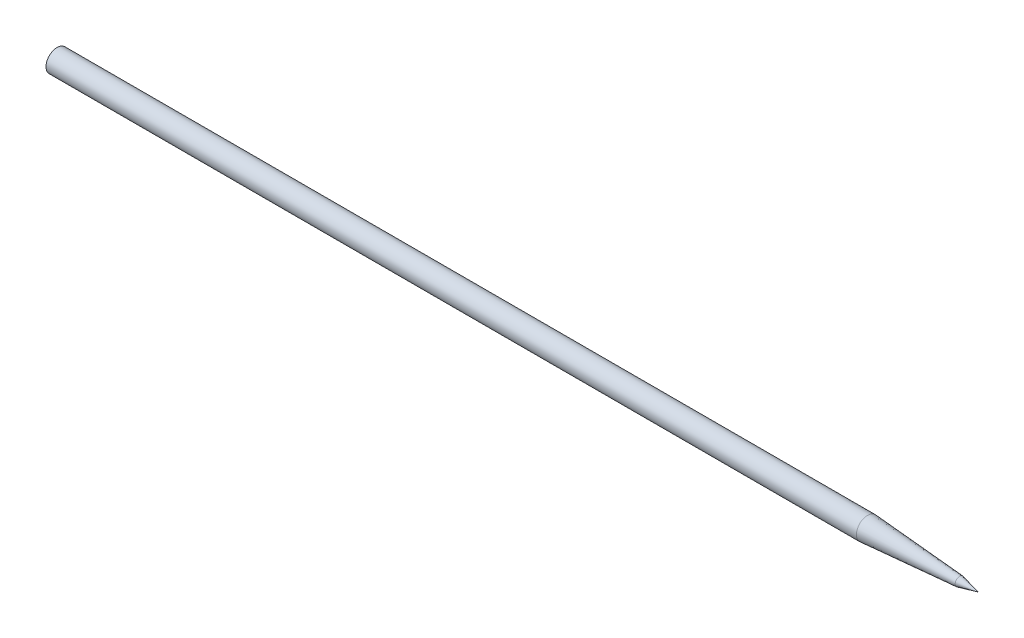
ISO-10303-21;
HEADER;
FILE_DESCRIPTION(('STEP AP214'),'2;1');
FILE_NAME('part.step','',(''),(''),'','','');
FILE_SCHEMA(('AUTOMOTIVE_DESIGN { 1 0 10303 214 1 1 1 1 }'));
ENDSEC;
DATA;
#1=APPLICATION_CONTEXT('core data for automotive mechanical design processes');
#2=APPLICATION_PROTOCOL_DEFINITION('international standard','automotive_design',2000,#1);
#3=PRODUCT_CONTEXT('',#1,'mechanical');
#4=PRODUCT('Part','Part','',(#3));
#5=PRODUCT_RELATED_PRODUCT_CATEGORY('part','',(#4));
#6=PRODUCT_DEFINITION_FORMATION('','',#4);
#7=PRODUCT_DEFINITION_CONTEXT('part definition',#1,'design');
#8=PRODUCT_DEFINITION('design','',#6,#7);
#9=PRODUCT_DEFINITION_SHAPE('','',#8);
#10=(LENGTH_UNIT() NAMED_UNIT(*) SI_UNIT(.MILLI.,.METRE.));
#11=(NAMED_UNIT(*) PLANE_ANGLE_UNIT() SI_UNIT($,.RADIAN.));
#12=(NAMED_UNIT(*) SI_UNIT($,.STERADIAN.) SOLID_ANGLE_UNIT());
#13=UNCERTAINTY_MEASURE_WITH_UNIT(LENGTH_MEASURE(1.E-05),#10,'distance_accuracy_value','');
#14=(GEOMETRIC_REPRESENTATION_CONTEXT(3) GLOBAL_UNCERTAINTY_ASSIGNED_CONTEXT((#13)) GLOBAL_UNIT_ASSIGNED_CONTEXT((#10,
#11,#12)) REPRESENTATION_CONTEXT('',''));
#15=CARTESIAN_POINT('',(0.,0.,0.));
#16=DIRECTION('',(0.,0.,1.));
#17=DIRECTION('',(1.,0.,0.));
#18=AXIS2_PLACEMENT_3D('',#15,#16,#17);
#19=CARTESIAN_POINT('',(0.,0.,0.));
#20=DIRECTION('',(1.,0.,0.));
#21=DIRECTION('',(0.,0.,-1.));
#22=AXIS2_PLACEMENT_3D('',#19,#20,#21);
#23=PLANE('',#22);
#24=CARTESIAN_POINT('',(0.,0.,0.));
#25=DIRECTION('',(-1.,0.,0.));
#26=DIRECTION('',(0.,0.,1.));
#27=AXIS2_PLACEMENT_3D('',#24,#25,#26);
#28=CIRCLE('',#27,3.);
#29=CARTESIAN_POINT('',(0.,0.,3.));
#30=VERTEX_POINT('',#29);
#31=EDGE_CURVE('E11',#30,#30,#28,.T.);
#32=ORIENTED_EDGE('',*,*,#31,.T.);
#33=EDGE_LOOP('',(#32));
#34=FACE_BOUND('',#33,.T.);
#35=ADVANCED_FACE('F39',(#34),#23,.F.);
#36=CARTESIAN_POINT('',(-10.,0.,0.));
#37=DIRECTION('',(-1.,0.,0.));
#38=DIRECTION('',(0.,0.,1.));
#39=AXIS2_PLACEMENT_3D('',#36,#37,#38);
#40=CYLINDRICAL_SURFACE('',#39,3.);
#41=ORIENTED_EDGE('',*,*,#31,.F.);
#42=EDGE_LOOP('',(#41));
#43=FACE_BOUND('',#42,.T.);
#44=CARTESIAN_POINT('',(220.,0.,0.));
#45=DIRECTION('',(-1.,0.,0.));
#46=DIRECTION('',(0.,0.,1.));
#47=AXIS2_PLACEMENT_3D('',#44,#45,#46);
#48=CIRCLE('',#47,3.);
#49=CARTESIAN_POINT('',(220.,0.,3.));
#50=VERTEX_POINT('',#49);
#51=EDGE_CURVE('E45',#50,#50,#48,.T.);
#52=ORIENTED_EDGE('',*,*,#51,.T.);
#53=EDGE_LOOP('',(#52));
#54=FACE_BOUND('',#53,.T.);
#55=ADVANCED_FACE('F56',(#43,#54),#40,.T.);
#56=CARTESIAN_POINT('',(245.,0.,0.));
#57=DIRECTION('',(-1.,0.,0.));
#58=DIRECTION('',(0.,0.,1.));
#59=AXIS2_PLACEMENT_3D('',#56,#57,#58);
#60=CONICAL_SURFACE('',#59,1.2,0.0718759695563349);
#61=ORIENTED_EDGE('',*,*,#51,.F.);
#62=EDGE_LOOP('',(#61));
#63=FACE_BOUND('',#62,.T.);
#64=CARTESIAN_POINT('',(245.,0.,0.));
#65=DIRECTION('',(-1.,0.,0.));
#66=DIRECTION('',(0.,0.,1.));
#67=AXIS2_PLACEMENT_3D('',#64,#65,#66);
#68=CIRCLE('',#67,1.2);
#69=CARTESIAN_POINT('',(245.,0.,1.2));
#70=VERTEX_POINT('',#69);
#71=EDGE_CURVE('E70',#70,#70,#68,.T.);
#72=ORIENTED_EDGE('',*,*,#71,.T.);
#73=EDGE_LOOP('',(#72));
#74=FACE_BOUND('',#73,.T.);
#75=ADVANCED_FACE('F50',(#63,#74),#60,.T.);
#76=CARTESIAN_POINT('',(250.,0.,0.));
#77=DIRECTION('',(-1.,0.,0.));
#78=DIRECTION('',(0.,0.,1.));
#79=AXIS2_PLACEMENT_3D('',#76,#77,#78);
#80=CONICAL_SURFACE('',#79,0.,0.235544980720863);
#81=ORIENTED_EDGE('',*,*,#71,.F.);
#82=EDGE_LOOP('',(#81));
#83=FACE_BOUND('',#82,.T.);
#84=CARTESIAN_POINT('',(250.,0.,0.));
#85=VERTEX_POINT('',#84);
#86=VERTEX_LOOP('',#85);
#87=FACE_BOUND('',#86,.T.);
#88=ADVANCED_FACE('F48',(#83,#87),#80,.T.);
#89=CLOSED_SHELL('',(#35,#55,#75,#88));
#90=MANIFOLD_SOLID_BREP('B2',#89);
#91=ADVANCED_BREP_SHAPE_REPRESENTATION('',(#18,#90),#14);
#92=SHAPE_DEFINITION_REPRESENTATION(#9,#91);
ENDSEC;
END-ISO-10303-21;
